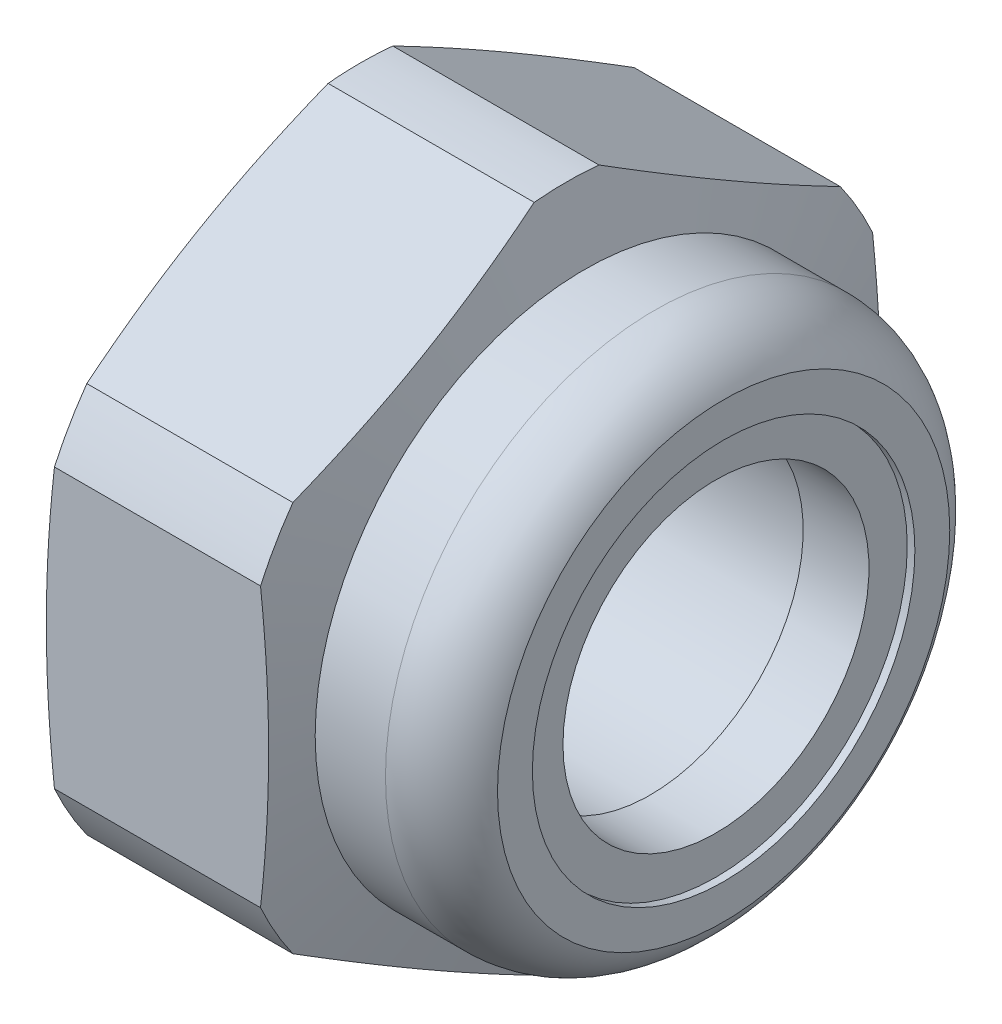
ISO-10303-21;
HEADER;
FILE_DESCRIPTION(('STEP AP214'),'2;1');
FILE_NAME('part.step','',(''),(''),'','','');
FILE_SCHEMA(('AUTOMOTIVE_DESIGN { 1 0 10303 214 1 1 1 1 }'));
ENDSEC;
DATA;
#1=APPLICATION_CONTEXT('core data for automotive mechanical design processes');
#2=APPLICATION_PROTOCOL_DEFINITION('international standard','automotive_design',2000,#1);
#3=PRODUCT_CONTEXT('',#1,'mechanical');
#4=PRODUCT('Part','Part','',(#3));
#5=PRODUCT_RELATED_PRODUCT_CATEGORY('part','',(#4));
#6=PRODUCT_DEFINITION_FORMATION('','',#4);
#7=PRODUCT_DEFINITION_CONTEXT('part definition',#1,'design');
#8=PRODUCT_DEFINITION('design','',#6,#7);
#9=PRODUCT_DEFINITION_SHAPE('','',#8);
#10=(LENGTH_UNIT() NAMED_UNIT(*) SI_UNIT(.MILLI.,.METRE.));
#11=(NAMED_UNIT(*) PLANE_ANGLE_UNIT() SI_UNIT($,.RADIAN.));
#12=(NAMED_UNIT(*) SI_UNIT($,.STERADIAN.) SOLID_ANGLE_UNIT());
#13=UNCERTAINTY_MEASURE_WITH_UNIT(LENGTH_MEASURE(1.E-05),#10,'distance_accuracy_value','');
#14=(GEOMETRIC_REPRESENTATION_CONTEXT(3) GLOBAL_UNCERTAINTY_ASSIGNED_CONTEXT((#13)) GLOBAL_UNIT_ASSIGNED_CONTEXT((#10,
#11,#12)) REPRESENTATION_CONTEXT('',''));
#15=CARTESIAN_POINT('',(0.,0.,0.));
#16=DIRECTION('',(0.,0.,1.));
#17=DIRECTION('',(1.,0.,0.));
#18=AXIS2_PLACEMENT_3D('',#15,#16,#17);
#19=CARTESIAN_POINT('',(1.47339400657629,0.,0.));
#20=DIRECTION('',(-1.,0.,0.));
#21=DIRECTION('',(0.,1.,0.));
#22=AXIS2_PLACEMENT_3D('',#19,#20,#21);
#23=CONICAL_SURFACE('',#22,3.9225,1.30899693899575);
#24=CARTESIAN_POINT('',(1.34678801315259,-4.37459941853982,0.422971544327751));
#25=CARTESIAN_POINT('',(1.54895552642481,-3.46410161513775,2.));
#26=CARTESIAN_POINT('',(1.34678801315259,-2.55360381173568,3.57702845567225));
#27=(BOUNDED_CURVE() B_SPLINE_CURVE(2,(#24,#25,#26),.UNSPECIFIED.,.F.,
.F.) B_SPLINE_CURVE_WITH_KNOTS((3,3),(0.,3.64813765694019),
.UNSPECIFIED.) CURVE() GEOMETRIC_REPRESENTATION_ITEM() RATIONAL_B_SPLINE_CURVE((1.,1.09875,1.)) REPRESENTATION_ITEM(''));
#28=CARTESIAN_POINT('',(1.34678801315259,-4.37459941853982,0.422971544327752));
#29=VERTEX_POINT('',#28);
#30=CARTESIAN_POINT('',(1.34678801315259,-2.55360381173568,3.57702845567225));
#31=VERTEX_POINT('',#30);
#32=EDGE_CURVE('E188',#29,#31,#27,.T.);
#33=ORIENTED_EDGE('',*,*,#32,.F.);
#34=CARTESIAN_POINT('',(1.34678801315259,0.,0.));
#35=DIRECTION('',(1.,0.,0.));
#36=DIRECTION('',(0.,1.,0.));
#37=AXIS2_PLACEMENT_3D('',#34,#35,#36);
#38=CIRCLE('',#37,4.395);
#39=CARTESIAN_POINT('',(1.34678801315259,-4.37459941853982,-0.42297154432775));
#40=VERTEX_POINT('',#39);
#41=EDGE_CURVE('E26',#29,#40,#38,.T.);
#42=ORIENTED_EDGE('',*,*,#41,.T.);
#43=CARTESIAN_POINT('',(1.34678801315259,-2.55360381173568,-3.57702845567225));
#44=CARTESIAN_POINT('',(1.54895552642481,-3.46410161513776,-2.));
#45=CARTESIAN_POINT('',(1.34678801315259,-4.37459941853983,-0.422971544327747));
#46=(BOUNDED_CURVE() B_SPLINE_CURVE(2,(#43,#44,#45),.UNSPECIFIED.,.F.,
.F.) B_SPLINE_CURVE_WITH_KNOTS((3,3),(0.,3.64813765694019),
.UNSPECIFIED.) CURVE() GEOMETRIC_REPRESENTATION_ITEM() RATIONAL_B_SPLINE_CURVE((1.,1.09875,1.)) REPRESENTATION_ITEM(''));
#47=CARTESIAN_POINT('',(1.34678801315259,-2.55360381173568,-3.57702845567225));
#48=VERTEX_POINT('',#47);
#49=EDGE_CURVE('E201',#48,#40,#46,.T.);
#50=ORIENTED_EDGE('',*,*,#49,.F.);
#51=CARTESIAN_POINT('',(1.34678801315259,0.,0.));
#52=DIRECTION('',(1.,0.,0.));
#53=DIRECTION('',(0.,1.,0.));
#54=AXIS2_PLACEMENT_3D('',#51,#52,#53);
#55=CIRCLE('',#54,4.395);
#56=CARTESIAN_POINT('',(1.34678801315259,-1.82099560680414,-4.));
#57=VERTEX_POINT('',#56);
#58=EDGE_CURVE('E103',#48,#57,#55,.T.);
#59=ORIENTED_EDGE('',*,*,#58,.T.);
#60=CARTESIAN_POINT('',(1.34678801315259,1.82099560680414,-4.));
#61=CARTESIAN_POINT('',(1.54895552642481,0.,-4.));
#62=CARTESIAN_POINT('',(1.34678801315259,-1.82099560680414,-4.));
#63=(BOUNDED_CURVE() B_SPLINE_CURVE(2,(#60,#61,#62),.UNSPECIFIED.,.F.,
.F.) B_SPLINE_CURVE_WITH_KNOTS((3,3),(0.,3.64813765694019),
.UNSPECIFIED.) CURVE() GEOMETRIC_REPRESENTATION_ITEM() RATIONAL_B_SPLINE_CURVE((1.,1.09875,1.)) REPRESENTATION_ITEM(''));
#64=CARTESIAN_POINT('',(1.34678801315259,1.82099560680414,-4.));
#65=VERTEX_POINT('',#64);
#66=EDGE_CURVE('E166',#65,#57,#63,.T.);
#67=ORIENTED_EDGE('',*,*,#66,.F.);
#68=CARTESIAN_POINT('',(1.34678801315259,0.,0.));
#69=DIRECTION('',(1.,0.,0.));
#70=DIRECTION('',(0.,1.,0.));
#71=AXIS2_PLACEMENT_3D('',#68,#69,#70);
#72=CIRCLE('',#71,4.395);
#73=CARTESIAN_POINT('',(1.34678801315259,2.55360381173568,-3.57702845567225));
#74=VERTEX_POINT('',#73);
#75=EDGE_CURVE('E111',#65,#74,#72,.T.);
#76=ORIENTED_EDGE('',*,*,#75,.T.);
#77=CARTESIAN_POINT('',(1.34678801315259,4.37459941853982,-0.422971544327753));
#78=CARTESIAN_POINT('',(1.54895552642481,3.46410161513775,-2.));
#79=CARTESIAN_POINT('',(1.34678801315259,2.55360381173568,-3.57702845567225));
#80=(BOUNDED_CURVE() B_SPLINE_CURVE(2,(#77,#78,#79),.UNSPECIFIED.,.F.,
.F.) B_SPLINE_CURVE_WITH_KNOTS((3,3),(0.,3.64813765694018),
.UNSPECIFIED.) CURVE() GEOMETRIC_REPRESENTATION_ITEM() RATIONAL_B_SPLINE_CURVE((1.,1.09875,1.)) REPRESENTATION_ITEM(''));
#81=CARTESIAN_POINT('',(1.34678801315259,4.37459941853982,-0.422971544327752));
#82=VERTEX_POINT('',#81);
#83=EDGE_CURVE('E162',#82,#74,#80,.T.);
#84=ORIENTED_EDGE('',*,*,#83,.F.);
#85=CARTESIAN_POINT('',(1.34678801315259,0.,0.));
#86=DIRECTION('',(1.,0.,0.));
#87=DIRECTION('',(0.,1.,0.));
#88=AXIS2_PLACEMENT_3D('',#85,#86,#87);
#89=CIRCLE('',#88,4.395);
#90=CARTESIAN_POINT('',(1.34678801315259,4.37459941853983,0.42297154432775));
#91=VERTEX_POINT('',#90);
#92=EDGE_CURVE('E200',#82,#91,#89,.T.);
#93=ORIENTED_EDGE('',*,*,#92,.T.);
#94=CARTESIAN_POINT('',(1.34678801315259,2.55360381173568,3.57702845567224));
#95=CARTESIAN_POINT('',(1.54895552642482,3.46410161513778,2.));
#96=CARTESIAN_POINT('',(1.34678801315259,4.37459941853982,0.422971544327751));
#97=(BOUNDED_CURVE() B_SPLINE_CURVE(2,(#94,#95,#96),.UNSPECIFIED.,.F.,
.F.) B_SPLINE_CURVE_WITH_KNOTS((3,3),(0.,3.64813765694018),
.UNSPECIFIED.) CURVE() GEOMETRIC_REPRESENTATION_ITEM() RATIONAL_B_SPLINE_CURVE((1.,1.09875,1.)) REPRESENTATION_ITEM(''));
#98=CARTESIAN_POINT('',(1.34678801315259,2.55360381173568,3.57702845567225));
#99=VERTEX_POINT('',#98);
#100=EDGE_CURVE('E157',#99,#91,#97,.T.);
#101=ORIENTED_EDGE('',*,*,#100,.F.);
#102=CARTESIAN_POINT('',(1.34678801315259,0.,0.));
#103=DIRECTION('',(1.,0.,0.));
#104=DIRECTION('',(0.,1.,0.));
#105=AXIS2_PLACEMENT_3D('',#102,#103,#104);
#106=CIRCLE('',#105,4.395);
#107=CARTESIAN_POINT('',(1.34678801315259,1.82099560680415,4.));
#108=VERTEX_POINT('',#107);
#109=EDGE_CURVE('E224',#99,#108,#106,.T.);
#110=ORIENTED_EDGE('',*,*,#109,.T.);
#111=CARTESIAN_POINT('',(1.34678801315259,-1.82099560680414,4.));
#112=CARTESIAN_POINT('',(1.54895552642481,0.,4.));
#113=CARTESIAN_POINT('',(1.34678801315259,1.82099560680415,4.));
#114=(BOUNDED_CURVE() B_SPLINE_CURVE(2,(#111,#112,#113),.UNSPECIFIED.,.F.,
.F.) B_SPLINE_CURVE_WITH_KNOTS((3,3),(0.,3.64813765694019),
.UNSPECIFIED.) CURVE() GEOMETRIC_REPRESENTATION_ITEM() RATIONAL_B_SPLINE_CURVE((1.,1.09875,1.)) REPRESENTATION_ITEM(''));
#115=CARTESIAN_POINT('',(1.34678801315259,-1.82099560680414,4.));
#116=VERTEX_POINT('',#115);
#117=EDGE_CURVE('E242',#116,#108,#114,.T.);
#118=ORIENTED_EDGE('',*,*,#117,.F.);
#119=CARTESIAN_POINT('',(1.34678801315259,0.,0.));
#120=DIRECTION('',(1.,0.,0.));
#121=DIRECTION('',(0.,1.,0.));
#122=AXIS2_PLACEMENT_3D('',#119,#120,#121);
#123=CIRCLE('',#122,4.395);
#124=EDGE_CURVE('E179',#116,#31,#123,.T.);
#125=ORIENTED_EDGE('',*,*,#124,.T.);
#126=EDGE_LOOP('',(#33,#42,#50,#59,#67,#76,#84,#93,#101,#110,#118,#125));
#127=FACE_BOUND('',#126,.T.);
#128=CARTESIAN_POINT('',(1.58124355652982,0.,0.));
#129=DIRECTION('',(-1.,0.,0.));
#130=DIRECTION('',(0.,0.,-1.));
#131=AXIS2_PLACEMENT_3D('',#128,#129,#130);
#132=CIRCLE('',#131,3.52);
#133=CARTESIAN_POINT('',(1.58124355652982,0.,3.52));
#134=VERTEX_POINT('',#133);
#135=EDGE_CURVE('E145',#134,#134,#132,.T.);
#136=ORIENTED_EDGE('',*,*,#135,.T.);
#137=EDGE_LOOP('',(#136));
#138=FACE_BOUND('',#137,.T.);
#139=ADVANCED_FACE('F16',(#127,#138),#23,.T.);
#140=CARTESIAN_POINT('',(-1.6,1.725,0.));
#141=DIRECTION('',(-1.,0.,0.));
#142=DIRECTION('',(0.,-1.,0.));
#143=AXIS2_PLACEMENT_3D('',#140,#141,#142);
#144=PLANE('',#143);
#145=CARTESIAN_POINT('',(-1.6,0.,0.));
#146=DIRECTION('',(1.,0.,0.));
#147=DIRECTION('',(0.,1.,0.));
#148=AXIS2_PLACEMENT_3D('',#145,#146,#147);
#149=CIRCLE('',#148,3.45);
#150=CARTESIAN_POINT('',(-1.6,3.45,0.));
#151=VERTEX_POINT('',#150);
#152=EDGE_CURVE('E10',#151,#151,#149,.T.);
#153=ORIENTED_EDGE('',*,*,#152,.F.);
#154=EDGE_LOOP('',(#153));
#155=FACE_BOUND('',#154,.T.);
#156=CARTESIAN_POINT('',(-1.6,0.,0.));
#157=DIRECTION('',(1.,0.,0.));
#158=DIRECTION('',(0.,1.,0.));
#159=AXIS2_PLACEMENT_3D('',#156,#157,#158);
#160=CIRCLE('',#159,2.5);
#161=CARTESIAN_POINT('',(-1.6,2.5,0.));
#162=VERTEX_POINT('',#161);
#163=EDGE_CURVE('E139',#162,#162,#160,.T.);
#164=ORIENTED_EDGE('',*,*,#163,.T.);
#165=EDGE_LOOP('',(#164));
#166=FACE_BOUND('',#165,.T.);
#167=ADVANCED_FACE('F140',(#155,#166),#144,.T.);
#168=CARTESIAN_POINT('',(-1.47339400657629,0.,0.));
#169=DIRECTION('',(1.,0.,0.));
#170=DIRECTION('',(0.,1.,0.));
#171=AXIS2_PLACEMENT_3D('',#168,#169,#170);
#172=CONICAL_SURFACE('',#171,3.9225,1.30899693899575);
#173=CARTESIAN_POINT('',(-1.34678801315259,-2.55360381173568,3.57702845567225));
#174=CARTESIAN_POINT('',(-1.54895552642481,-3.46410161513775,2.));
#175=CARTESIAN_POINT('',(-1.34678801315259,-4.37459941853982,0.422971544327751));
#176=(BOUNDED_CURVE() B_SPLINE_CURVE(2,(#173,#174,#175),.UNSPECIFIED.,.F.,
.F.) B_SPLINE_CURVE_WITH_KNOTS((3,3),(0.,3.64813765694019),
.UNSPECIFIED.) CURVE() GEOMETRIC_REPRESENTATION_ITEM() RATIONAL_B_SPLINE_CURVE((1.,1.09875,1.)) REPRESENTATION_ITEM(''));
#177=CARTESIAN_POINT('',(-1.34678801315259,-2.55360381173568,3.57702845567225));
#178=VERTEX_POINT('',#177);
#179=CARTESIAN_POINT('',(-1.34678801315259,-4.37459941853982,0.422971544327752));
#180=VERTEX_POINT('',#179);
#181=EDGE_CURVE('E260',#178,#180,#176,.T.);
#182=ORIENTED_EDGE('',*,*,#181,.F.);
#183=CARTESIAN_POINT('',(-1.34678801315259,0.,0.));
#184=DIRECTION('',(1.,0.,0.));
#185=DIRECTION('',(0.,1.,0.));
#186=AXIS2_PLACEMENT_3D('',#183,#184,#185);
#187=CIRCLE('',#186,4.395);
#188=CARTESIAN_POINT('',(-1.34678801315259,-1.82099560680414,4.));
#189=VERTEX_POINT('',#188);
#190=EDGE_CURVE('E250',#189,#178,#187,.T.);
#191=ORIENTED_EDGE('',*,*,#190,.F.);
#192=CARTESIAN_POINT('',(-1.34678801315259,1.82099560680414,4.));
#193=CARTESIAN_POINT('',(-1.54895552642481,0.,4.));
#194=CARTESIAN_POINT('',(-1.34678801315259,-1.82099560680414,4.));
#195=(BOUNDED_CURVE() B_SPLINE_CURVE(2,(#192,#193,#194),.UNSPECIFIED.,.F.,
.F.) B_SPLINE_CURVE_WITH_KNOTS((3,3),(0.,3.64813765694018),
.UNSPECIFIED.) CURVE() GEOMETRIC_REPRESENTATION_ITEM() RATIONAL_B_SPLINE_CURVE((1.,1.09875,1.)) REPRESENTATION_ITEM(''));
#196=CARTESIAN_POINT('',(-1.34678801315259,1.82099560680415,4.));
#197=VERTEX_POINT('',#196);
#198=EDGE_CURVE('E284',#197,#189,#195,.T.);
#199=ORIENTED_EDGE('',*,*,#198,.F.);
#200=CARTESIAN_POINT('',(-1.34678801315259,0.,0.));
#201=DIRECTION('',(1.,0.,0.));
#202=DIRECTION('',(0.,1.,0.));
#203=AXIS2_PLACEMENT_3D('',#200,#201,#202);
#204=CIRCLE('',#203,4.395);
#205=CARTESIAN_POINT('',(-1.34678801315259,2.55360381173568,3.57702845567225));
#206=VERTEX_POINT('',#205);
#207=EDGE_CURVE('E226',#206,#197,#204,.T.);
#208=ORIENTED_EDGE('',*,*,#207,.F.);
#209=CARTESIAN_POINT('',(-1.34678801315259,4.37459941853982,0.42297154432775));
#210=CARTESIAN_POINT('',(-1.54895552642481,3.46410161513775,2.));
#211=CARTESIAN_POINT('',(-1.34678801315259,2.55360381173568,3.57702845567224));
#212=(BOUNDED_CURVE() B_SPLINE_CURVE(2,(#209,#210,#211),.UNSPECIFIED.,.F.,
.F.) B_SPLINE_CURVE_WITH_KNOTS((3,3),(0.,3.64813765694018),
.UNSPECIFIED.) CURVE() GEOMETRIC_REPRESENTATION_ITEM() RATIONAL_B_SPLINE_CURVE((1.,1.09875,1.)) REPRESENTATION_ITEM(''));
#213=CARTESIAN_POINT('',(-1.34678801315259,4.37459941853983,0.42297154432775));
#214=VERTEX_POINT('',#213);
#215=EDGE_CURVE('E167',#214,#206,#212,.T.);
#216=ORIENTED_EDGE('',*,*,#215,.F.);
#217=CARTESIAN_POINT('',(-1.34678801315259,0.,0.));
#218=DIRECTION('',(1.,0.,0.));
#219=DIRECTION('',(0.,1.,0.));
#220=AXIS2_PLACEMENT_3D('',#217,#218,#219);
#221=CIRCLE('',#220,4.395);
#222=CARTESIAN_POINT('',(-1.34678801315259,4.37459941853982,-0.422971544327752));
#223=VERTEX_POINT('',#222);
#224=EDGE_CURVE('E203',#223,#214,#221,.T.);
#225=ORIENTED_EDGE('',*,*,#224,.F.);
#226=CARTESIAN_POINT('',(-1.34678801315259,2.55360381173568,-3.57702845567225));
#227=CARTESIAN_POINT('',(-1.54895552642481,3.46410161513777,-2.));
#228=CARTESIAN_POINT('',(-1.34678801315259,4.37459941853982,-0.422971544327752));
#229=(BOUNDED_CURVE() B_SPLINE_CURVE(2,(#226,#227,#228),.UNSPECIFIED.,.F.,
.F.) B_SPLINE_CURVE_WITH_KNOTS((3,3),(0.,3.64813765694019),
.UNSPECIFIED.) CURVE() GEOMETRIC_REPRESENTATION_ITEM() RATIONAL_B_SPLINE_CURVE((1.,1.09875,1.)) REPRESENTATION_ITEM(''));
#230=CARTESIAN_POINT('',(-1.34678801315259,2.55360381173568,-3.57702845567225));
#231=VERTEX_POINT('',#230);
#232=EDGE_CURVE('E156',#231,#223,#229,.T.);
#233=ORIENTED_EDGE('',*,*,#232,.F.);
#234=CARTESIAN_POINT('',(-1.34678801315259,0.,0.));
#235=DIRECTION('',(1.,0.,0.));
#236=DIRECTION('',(0.,1.,0.));
#237=AXIS2_PLACEMENT_3D('',#234,#235,#236);
#238=CIRCLE('',#237,4.395);
#239=CARTESIAN_POINT('',(-1.34678801315259,1.82099560680414,-4.));
#240=VERTEX_POINT('',#239);
#241=EDGE_CURVE('E151',#240,#231,#238,.T.);
#242=ORIENTED_EDGE('',*,*,#241,.F.);
#243=CARTESIAN_POINT('',(-1.34678801315259,-1.82099560680414,-4.));
#244=CARTESIAN_POINT('',(-1.54895552642481,0.,-4.));
#245=CARTESIAN_POINT('',(-1.34678801315259,1.82099560680414,-4.));
#246=(BOUNDED_CURVE() B_SPLINE_CURVE(2,(#243,#244,#245),.UNSPECIFIED.,.F.,
.F.) B_SPLINE_CURVE_WITH_KNOTS((3,3),(0.,3.64813765694018),
.UNSPECIFIED.) CURVE() GEOMETRIC_REPRESENTATION_ITEM() RATIONAL_B_SPLINE_CURVE((1.,1.09875,1.)) REPRESENTATION_ITEM(''));
#247=CARTESIAN_POINT('',(-1.34678801315259,-1.82099560680414,-4.));
#248=VERTEX_POINT('',#247);
#249=EDGE_CURVE('E161',#248,#240,#246,.T.);
#250=ORIENTED_EDGE('',*,*,#249,.F.);
#251=CARTESIAN_POINT('',(-1.34678801315259,0.,0.));
#252=DIRECTION('',(1.,0.,0.));
#253=DIRECTION('',(0.,1.,0.));
#254=AXIS2_PLACEMENT_3D('',#251,#252,#253);
#255=CIRCLE('',#254,4.395);
#256=CARTESIAN_POINT('',(-1.34678801315259,-2.55360381173568,-3.57702845567225));
#257=VERTEX_POINT('',#256);
#258=EDGE_CURVE('E174',#257,#248,#255,.T.);
#259=ORIENTED_EDGE('',*,*,#258,.F.);
#260=CARTESIAN_POINT('',(-1.34678801315259,-4.37459941853982,-0.422971544327751));
#261=CARTESIAN_POINT('',(-1.54895552642481,-3.46410161513776,-2.));
#262=CARTESIAN_POINT('',(-1.34678801315259,-2.55360381173568,-3.57702845567225));
#263=(BOUNDED_CURVE() B_SPLINE_CURVE(2,(#260,#261,#262),.UNSPECIFIED.,.F.,
.F.) B_SPLINE_CURVE_WITH_KNOTS((3,3),(0.,3.64813765694018),
.UNSPECIFIED.) CURVE() GEOMETRIC_REPRESENTATION_ITEM() RATIONAL_B_SPLINE_CURVE((1.,1.09875,1.)) REPRESENTATION_ITEM(''));
#264=CARTESIAN_POINT('',(-1.34678801315259,-4.37459941853982,-0.42297154432775));
#265=VERTEX_POINT('',#264);
#266=EDGE_CURVE('E213',#265,#257,#263,.T.);
#267=ORIENTED_EDGE('',*,*,#266,.F.);
#268=CARTESIAN_POINT('',(-1.34678801315259,0.,0.));
#269=DIRECTION('',(1.,0.,0.));
#270=DIRECTION('',(0.,1.,0.));
#271=AXIS2_PLACEMENT_3D('',#268,#269,#270);
#272=CIRCLE('',#271,4.395);
#273=EDGE_CURVE('E254',#180,#265,#272,.T.);
#274=ORIENTED_EDGE('',*,*,#273,.F.);
#275=EDGE_LOOP('',(#182,#191,#199,#208,#216,#225,#233,#242,#250,#259,#267,#274));
#276=FACE_BOUND('',#275,.T.);
#277=ORIENTED_EDGE('',*,*,#152,.T.);
#278=EDGE_LOOP('',(#277));
#279=FACE_BOUND('',#278,.T.);
#280=ADVANCED_FACE('F320',(#276,#279),#172,.T.);
#281=CARTESIAN_POINT('',(0.,0.,0.));
#282=DIRECTION('',(-1.,0.,0.));
#283=DIRECTION('',(0.,1.,0.));
#284=AXIS2_PLACEMENT_3D('',#281,#282,#283);
#285=CYLINDRICAL_SURFACE('',#284,4.395);
#286=DIRECTION('',(1.,0.,0.));
#287=VECTOR('',#286,1.);
#288=CARTESIAN_POINT('',(0.,-4.37459941853982,0.422971544327752));
#289=LINE('',#288,#287);
#290=EDGE_CURVE('E193',#180,#29,#289,.T.);
#291=ORIENTED_EDGE('',*,*,#290,.F.);
#292=ORIENTED_EDGE('',*,*,#273,.T.);
#293=DIRECTION('',(-1.,0.,0.));
#294=VECTOR('',#293,1.);
#295=CARTESIAN_POINT('',(0.,-4.37459941853982,-0.42297154432775));
#296=LINE('',#295,#294);
#297=EDGE_CURVE('E194',#40,#265,#296,.T.);
#298=ORIENTED_EDGE('',*,*,#297,.F.);
#299=ORIENTED_EDGE('',*,*,#41,.F.);
#300=EDGE_LOOP('',(#291,#292,#298,#299));
#301=FACE_BOUND('',#300,.T.);
#302=ADVANCED_FACE('F402',(#301),#285,.T.);
#303=CARTESIAN_POINT('',(0.,0.,0.));
#304=DIRECTION('',(-1.,0.,0.));
#305=DIRECTION('',(0.,1.,0.));
#306=AXIS2_PLACEMENT_3D('',#303,#304,#305);
#307=CYLINDRICAL_SURFACE('',#306,4.395);
#308=DIRECTION('',(-1.,0.,0.));
#309=VECTOR('',#308,1.);
#310=CARTESIAN_POINT('',(0.,-2.55360381173568,3.57702845567225));
#311=LINE('',#310,#309);
#312=EDGE_CURVE('E20',#31,#178,#311,.T.);
#313=ORIENTED_EDGE('',*,*,#312,.F.);
#314=ORIENTED_EDGE('',*,*,#124,.F.);
#315=DIRECTION('',(1.,0.,0.));
#316=VECTOR('',#315,1.);
#317=CARTESIAN_POINT('',(0.,-1.82099560680414,4.));
#318=LINE('',#317,#316);
#319=EDGE_CURVE('E289',#189,#116,#318,.T.);
#320=ORIENTED_EDGE('',*,*,#319,.F.);
#321=ORIENTED_EDGE('',*,*,#190,.T.);
#322=EDGE_LOOP('',(#313,#314,#320,#321));
#323=FACE_BOUND('',#322,.T.);
#324=ADVANCED_FACE('F406',(#323),#307,.T.);
#325=CARTESIAN_POINT('',(0.,0.,0.));
#326=DIRECTION('',(-1.,0.,0.));
#327=DIRECTION('',(0.,1.,0.));
#328=AXIS2_PLACEMENT_3D('',#325,#326,#327);
#329=CYLINDRICAL_SURFACE('',#328,4.395);
#330=DIRECTION('',(-1.,0.,0.));
#331=VECTOR('',#330,1.);
#332=CARTESIAN_POINT('',(0.,-1.82099560680414,-4.));
#333=LINE('',#332,#331);
#334=EDGE_CURVE('E183',#57,#248,#333,.T.);
#335=ORIENTED_EDGE('',*,*,#334,.F.);
#336=ORIENTED_EDGE('',*,*,#58,.F.);
#337=DIRECTION('',(1.,0.,0.));
#338=VECTOR('',#337,1.);
#339=CARTESIAN_POINT('',(0.,-2.55360381173568,-3.57702845567225));
#340=LINE('',#339,#338);
#341=EDGE_CURVE('E218',#257,#48,#340,.T.);
#342=ORIENTED_EDGE('',*,*,#341,.F.);
#343=ORIENTED_EDGE('',*,*,#258,.T.);
#344=EDGE_LOOP('',(#335,#336,#342,#343));
#345=FACE_BOUND('',#344,.T.);
#346=ADVANCED_FACE('F337',(#345),#329,.T.);
#347=CARTESIAN_POINT('',(0.,0.,0.));
#348=DIRECTION('',(-1.,0.,0.));
#349=DIRECTION('',(0.,1.,0.));
#350=AXIS2_PLACEMENT_3D('',#347,#348,#349);
#351=CYLINDRICAL_SURFACE('',#350,4.395);
#352=DIRECTION('',(-1.,0.,0.));
#353=VECTOR('',#352,1.);
#354=CARTESIAN_POINT('',(0.,1.82099560680415,4.));
#355=LINE('',#354,#353);
#356=EDGE_CURVE('E173',#108,#197,#355,.T.);
#357=ORIENTED_EDGE('',*,*,#356,.F.);
#358=ORIENTED_EDGE('',*,*,#109,.F.);
#359=DIRECTION('',(1.,0.,0.));
#360=VECTOR('',#359,1.);
#361=CARTESIAN_POINT('',(0.,2.55360381173568,3.57702845567225));
#362=LINE('',#361,#360);
#363=EDGE_CURVE('E172',#206,#99,#362,.T.);
#364=ORIENTED_EDGE('',*,*,#363,.F.);
#365=ORIENTED_EDGE('',*,*,#207,.T.);
#366=EDGE_LOOP('',(#357,#358,#364,#365));
#367=FACE_BOUND('',#366,.T.);
#368=ADVANCED_FACE('F328',(#367),#351,.T.);
#369=CARTESIAN_POINT('',(0.,0.,0.));
#370=DIRECTION('',(-1.,0.,0.));
#371=DIRECTION('',(0.,1.,0.));
#372=AXIS2_PLACEMENT_3D('',#369,#370,#371);
#373=CYLINDRICAL_SURFACE('',#372,4.395);
#374=DIRECTION('',(-1.,0.,0.));
#375=VECTOR('',#374,1.);
#376=CARTESIAN_POINT('',(0.,2.55360381173568,-3.57702845567225));
#377=LINE('',#376,#375);
#378=EDGE_CURVE('E158',#74,#231,#377,.T.);
#379=ORIENTED_EDGE('',*,*,#378,.F.);
#380=ORIENTED_EDGE('',*,*,#75,.F.);
#381=DIRECTION('',(1.,0.,0.));
#382=VECTOR('',#381,1.);
#383=CARTESIAN_POINT('',(0.,1.82099560680414,-4.));
#384=LINE('',#383,#382);
#385=EDGE_CURVE('E163',#240,#65,#384,.T.);
#386=ORIENTED_EDGE('',*,*,#385,.F.);
#387=ORIENTED_EDGE('',*,*,#241,.T.);
#388=EDGE_LOOP('',(#379,#380,#386,#387));
#389=FACE_BOUND('',#388,.T.);
#390=ADVANCED_FACE('F325',(#389),#373,.T.);
#391=CARTESIAN_POINT('',(0.,0.,0.));
#392=DIRECTION('',(-1.,0.,0.));
#393=DIRECTION('',(0.,1.,0.));
#394=AXIS2_PLACEMENT_3D('',#391,#392,#393);
#395=CYLINDRICAL_SURFACE('',#394,4.395);
#396=DIRECTION('',(-1.,0.,0.));
#397=VECTOR('',#396,1.);
#398=CARTESIAN_POINT('',(0.,4.37459941853983,0.42297154432775));
#399=LINE('',#398,#397);
#400=EDGE_CURVE('E153',#91,#214,#399,.T.);
#401=ORIENTED_EDGE('',*,*,#400,.F.);
#402=ORIENTED_EDGE('',*,*,#92,.F.);
#403=DIRECTION('',(1.,0.,0.));
#404=VECTOR('',#403,1.);
#405=CARTESIAN_POINT('',(0.,4.37459941853982,-0.422971544327752));
#406=LINE('',#405,#404);
#407=EDGE_CURVE('E245',#223,#82,#406,.T.);
#408=ORIENTED_EDGE('',*,*,#407,.F.);
#409=ORIENTED_EDGE('',*,*,#224,.T.);
#410=EDGE_LOOP('',(#401,#402,#408,#409));
#411=FACE_BOUND('',#410,.T.);
#412=ADVANCED_FACE('F327',(#411),#395,.T.);
#413=CARTESIAN_POINT('',(-2.1,-3.46410161513775,-2.));
#414=DIRECTION('',(0.,-0.866025403784439,-0.5));
#415=DIRECTION('',(0.,0.5,-0.866025403784439));
#416=AXIS2_PLACEMENT_3D('',#413,#414,#415);
#417=PLANE('',#416);
#418=ORIENTED_EDGE('',*,*,#266,.T.);
#419=ORIENTED_EDGE('',*,*,#341,.T.);
#420=ORIENTED_EDGE('',*,*,#49,.T.);
#421=ORIENTED_EDGE('',*,*,#297,.T.);
#422=EDGE_LOOP('',(#418,#419,#420,#421));
#423=FACE_BOUND('',#422,.T.);
#424=ADVANCED_FACE('F335',(#423),#417,.T.);
#425=CARTESIAN_POINT('',(-2.1,0.,-4.));
#426=DIRECTION('',(0.,0.,-1.));
#427=DIRECTION('',(0.,1.,0.));
#428=AXIS2_PLACEMENT_3D('',#425,#426,#427);
#429=PLANE('',#428);
#430=ORIENTED_EDGE('',*,*,#249,.T.);
#431=ORIENTED_EDGE('',*,*,#385,.T.);
#432=ORIENTED_EDGE('',*,*,#66,.T.);
#433=ORIENTED_EDGE('',*,*,#334,.T.);
#434=EDGE_LOOP('',(#430,#431,#432,#433));
#435=FACE_BOUND('',#434,.T.);
#436=ADVANCED_FACE('F317',(#435),#429,.T.);
#437=CARTESIAN_POINT('',(-2.1,3.46410161513775,-2.));
#438=DIRECTION('',(0.,0.866025403784439,-0.5));
#439=DIRECTION('',(0.,0.5,0.866025403784439));
#440=AXIS2_PLACEMENT_3D('',#437,#438,#439);
#441=PLANE('',#440);
#442=ORIENTED_EDGE('',*,*,#232,.T.);
#443=ORIENTED_EDGE('',*,*,#407,.T.);
#444=ORIENTED_EDGE('',*,*,#83,.T.);
#445=ORIENTED_EDGE('',*,*,#378,.T.);
#446=EDGE_LOOP('',(#442,#443,#444,#445));
#447=FACE_BOUND('',#446,.T.);
#448=ADVANCED_FACE('F419',(#447),#441,.T.);
#449=CARTESIAN_POINT('',(-2.1,3.46410161513775,2.));
#450=DIRECTION('',(0.,0.866025403784439,0.5));
#451=DIRECTION('',(0.,-0.5,0.866025403784439));
#452=AXIS2_PLACEMENT_3D('',#449,#450,#451);
#453=PLANE('',#452);
#454=ORIENTED_EDGE('',*,*,#215,.T.);
#455=ORIENTED_EDGE('',*,*,#363,.T.);
#456=ORIENTED_EDGE('',*,*,#100,.T.);
#457=ORIENTED_EDGE('',*,*,#400,.T.);
#458=EDGE_LOOP('',(#454,#455,#456,#457));
#459=FACE_BOUND('',#458,.T.);
#460=ADVANCED_FACE('F423',(#459),#453,.T.);
#461=CARTESIAN_POINT('',(-2.1,0.,4.));
#462=DIRECTION('',(0.,0.,1.));
#463=DIRECTION('',(0.,-1.,0.));
#464=AXIS2_PLACEMENT_3D('',#461,#462,#463);
#465=PLANE('',#464);
#466=ORIENTED_EDGE('',*,*,#198,.T.);
#467=ORIENTED_EDGE('',*,*,#319,.T.);
#468=ORIENTED_EDGE('',*,*,#117,.T.);
#469=ORIENTED_EDGE('',*,*,#356,.T.);
#470=EDGE_LOOP('',(#466,#467,#468,#469));
#471=FACE_BOUND('',#470,.T.);
#472=ADVANCED_FACE('F421',(#471),#465,.T.);
#473=CARTESIAN_POINT('',(-2.1,-3.46410161513775,2.));
#474=DIRECTION('',(0.,-0.866025403784439,0.5));
#475=DIRECTION('',(0.,-0.5,-0.866025403784439));
#476=AXIS2_PLACEMENT_3D('',#473,#474,#475);
#477=PLANE('',#476);
#478=ORIENTED_EDGE('',*,*,#181,.T.);
#479=ORIENTED_EDGE('',*,*,#290,.T.);
#480=ORIENTED_EDGE('',*,*,#32,.T.);
#481=ORIENTED_EDGE('',*,*,#312,.T.);
#482=EDGE_LOOP('',(#478,#479,#480,#481));
#483=FACE_BOUND('',#482,.T.);
#484=ADVANCED_FACE('F397',(#483),#477,.T.);
#485=CARTESIAN_POINT('',(3.4,0.,0.));
#486=DIRECTION('',(1.,0.,0.));
#487=DIRECTION('',(0.,0.,-1.));
#488=AXIS2_PLACEMENT_3D('',#485,#486,#487);
#489=PLANE('',#488);
#490=CARTESIAN_POINT('',(3.4,0.,0.));
#491=DIRECTION('',(1.,0.,0.));
#492=DIRECTION('',(0.,0.,-1.));
#493=AXIS2_PLACEMENT_3D('',#490,#491,#492);
#494=CIRCLE('',#493,2.95588989435407);
#495=CARTESIAN_POINT('',(3.4,0.,2.95588989435407));
#496=VERTEX_POINT('',#495);
#497=EDGE_CURVE('E267',#496,#496,#494,.T.);
#498=ORIENTED_EDGE('',*,*,#497,.T.);
#499=EDGE_LOOP('',(#498));
#500=FACE_BOUND('',#499,.T.);
#501=CARTESIAN_POINT('',(3.4,0.,0.));
#502=DIRECTION('',(-1.,0.,0.));
#503=DIRECTION('',(0.,1.,0.));
#504=AXIS2_PLACEMENT_3D('',#501,#502,#503);
#505=CIRCLE('',#504,2.5);
#506=CARTESIAN_POINT('',(3.4,2.5,0.));
#507=VERTEX_POINT('',#506);
#508=EDGE_CURVE('E147',#507,#507,#505,.T.);
#509=ORIENTED_EDGE('',*,*,#508,.T.);
#510=EDGE_LOOP('',(#509));
#511=FACE_BOUND('',#510,.T.);
#512=ADVANCED_FACE('F394',(#500,#511),#489,.T.);
#513=CARTESIAN_POINT('',(2.5,0.,0.));
#514=DIRECTION('',(1.,0.,0.));
#515=DIRECTION('',(0.,0.,1.));
#516=AXIS2_PLACEMENT_3D('',#513,#514,#515);
#517=TOROIDAL_SURFACE('',#516,2.52,1.);
#518=ORIENTED_EDGE('',*,*,#497,.F.);
#519=EDGE_LOOP('',(#518));
#520=FACE_BOUND('',#519,.T.);
#521=CARTESIAN_POINT('',(2.5,0.,0.));
#522=DIRECTION('',(-1.,0.,0.));
#523=DIRECTION('',(0.,0.,-1.));
#524=AXIS2_PLACEMENT_3D('',#521,#522,#523);
#525=CIRCLE('',#524,3.52);
#526=CARTESIAN_POINT('',(2.5,-3.52,0.));
#527=VERTEX_POINT('',#526);
#528=EDGE_CURVE('E142',#527,#527,#525,.T.);
#529=ORIENTED_EDGE('',*,*,#528,.F.);
#530=EDGE_LOOP('',(#529));
#531=FACE_BOUND('',#530,.T.);
#532=ADVANCED_FACE('F396',(#520,#531),#517,.T.);
#533=CARTESIAN_POINT('',(1.7,0.,0.));
#534=DIRECTION('',(-1.,0.,0.));
#535=DIRECTION('',(0.,0.,-1.));
#536=AXIS2_PLACEMENT_3D('',#533,#534,#535);
#537=CYLINDRICAL_SURFACE('',#536,3.52);
#538=ORIENTED_EDGE('',*,*,#135,.F.);
#539=EDGE_LOOP('',(#538));
#540=FACE_BOUND('',#539,.T.);
#541=ORIENTED_EDGE('',*,*,#528,.T.);
#542=EDGE_LOOP('',(#541));
#543=FACE_BOUND('',#542,.T.);
#544=ADVANCED_FACE('F18',(#540,#543),#537,.T.);
#545=CARTESIAN_POINT('',(0.9,0.,0.));
#546=DIRECTION('',(-1.,0.,0.));
#547=DIRECTION('',(0.,1.,0.));
#548=AXIS2_PLACEMENT_3D('',#545,#546,#547);
#549=CYLINDRICAL_SURFACE('',#548,2.067);
#550=CARTESIAN_POINT('',(-1.167,0.,0.));
#551=DIRECTION('',(1.,0.,0.));
#552=DIRECTION('',(0.,1.,0.));
#553=AXIS2_PLACEMENT_3D('',#550,#551,#552);
#554=CIRCLE('',#553,2.067);
#555=CARTESIAN_POINT('',(-1.167,2.067,0.));
#556=VERTEX_POINT('',#555);
#557=EDGE_CURVE('E143',#556,#556,#554,.T.);
#558=ORIENTED_EDGE('',*,*,#557,.F.);
#559=EDGE_LOOP('',(#558));
#560=FACE_BOUND('',#559,.T.);
#561=CARTESIAN_POINT('',(2.44,0.,0.));
#562=DIRECTION('',(1.,0.,0.));
#563=DIRECTION('',(0.,1.,0.));
#564=AXIS2_PLACEMENT_3D('',#561,#562,#563);
#565=CIRCLE('',#564,2.067);
#566=CARTESIAN_POINT('',(2.44,-2.067,0.));
#567=VERTEX_POINT('',#566);
#568=EDGE_CURVE('E212',#567,#567,#565,.T.);
#569=ORIENTED_EDGE('',*,*,#568,.T.);
#570=EDGE_LOOP('',(#569));
#571=FACE_BOUND('',#570,.T.);
#572=ADVANCED_FACE('F353',(#560,#571),#549,.F.);
#573=CARTESIAN_POINT('',(-1.3835,0.,0.));
#574=DIRECTION('',(-1.,0.,0.));
#575=DIRECTION('',(0.,1.,0.));
#576=AXIS2_PLACEMENT_3D('',#573,#574,#575);
#577=CONICAL_SURFACE('',#576,2.2835,0.785398163397449);
#578=ORIENTED_EDGE('',*,*,#163,.F.);
#579=EDGE_LOOP('',(#578));
#580=FACE_BOUND('',#579,.T.);
#581=ORIENTED_EDGE('',*,*,#557,.T.);
#582=EDGE_LOOP('',(#581));
#583=FACE_BOUND('',#582,.T.);
#584=ADVANCED_FACE('F356',(#580,#583),#577,.F.);
#585=CARTESIAN_POINT('',(3.58,0.,0.));
#586=DIRECTION('',(1.,0.,0.));
#587=DIRECTION('',(0.,0.,1.));
#588=AXIS2_PLACEMENT_3D('',#585,#586,#587);
#589=CYLINDRICAL_SURFACE('',#588,2.5);
#590=ORIENTED_EDGE('',*,*,#508,.F.);
#591=EDGE_LOOP('',(#590));
#592=FACE_BOUND('',#591,.T.);
#593=CARTESIAN_POINT('',(3.3,0.,0.));
#594=DIRECTION('',(-1.,0.,0.));
#595=DIRECTION('',(0.,0.,1.));
#596=AXIS2_PLACEMENT_3D('',#593,#594,#595);
#597=CIRCLE('',#596,2.5);
#598=CARTESIAN_POINT('',(3.3,0.,-2.5));
#599=VERTEX_POINT('',#598);
#600=EDGE_CURVE('E229',#599,#599,#597,.T.);
#601=ORIENTED_EDGE('',*,*,#600,.T.);
#602=EDGE_LOOP('',(#601));
#603=FACE_BOUND('',#602,.T.);
#604=ADVANCED_FACE('F358',(#592,#603),#589,.F.);
#605=CARTESIAN_POINT('',(2.2,0.,0.));
#606=DIRECTION('',(-1.,0.,0.));
#607=DIRECTION('',(0.,0.,-1.));
#608=AXIS2_PLACEMENT_3D('',#605,#606,#607);
#609=CYLINDRICAL_SURFACE('',#608,2.);
#610=CARTESIAN_POINT('',(3.3,0.,0.));
#611=DIRECTION('',(-1.,0.,0.));
#612=DIRECTION('',(0.,0.,-1.));
#613=AXIS2_PLACEMENT_3D('',#610,#611,#612);
#614=CIRCLE('',#613,2.);
#615=CARTESIAN_POINT('',(3.3,0.,2.));
#616=VERTEX_POINT('',#615);
#617=EDGE_CURVE('E227',#616,#616,#614,.T.);
#618=ORIENTED_EDGE('',*,*,#617,.F.);
#619=EDGE_LOOP('',(#618));
#620=FACE_BOUND('',#619,.T.);
#621=CARTESIAN_POINT('',(2.44,0.,0.));
#622=DIRECTION('',(1.,0.,0.));
#623=DIRECTION('',(0.,0.,-1.));
#624=AXIS2_PLACEMENT_3D('',#621,#622,#623);
#625=CIRCLE('',#624,2.);
#626=CARTESIAN_POINT('',(2.44,0.,2.));
#627=VERTEX_POINT('',#626);
#628=EDGE_CURVE('E235',#627,#627,#625,.T.);
#629=ORIENTED_EDGE('',*,*,#628,.F.);
#630=EDGE_LOOP('',(#629));
#631=FACE_BOUND('',#630,.T.);
#632=ADVANCED_FACE('F360',(#620,#631),#609,.F.);
#633=CARTESIAN_POINT('',(2.44,0.,0.));
#634=DIRECTION('',(-1.,0.,0.));
#635=DIRECTION('',(0.,0.,1.));
#636=AXIS2_PLACEMENT_3D('',#633,#634,#635);
#637=PLANE('',#636);
#638=ORIENTED_EDGE('',*,*,#568,.F.);
#639=EDGE_LOOP('',(#638));
#640=FACE_BOUND('',#639,.T.);
#641=ORIENTED_EDGE('',*,*,#628,.T.);
#642=EDGE_LOOP('',(#641));
#643=FACE_BOUND('',#642,.T.);
#644=ADVANCED_FACE('F367',(#640,#643),#637,.T.);
#645=CARTESIAN_POINT('',(3.3,0.,0.));
#646=DIRECTION('',(1.,0.,0.));
#647=DIRECTION('',(0.,0.,-1.));
#648=AXIS2_PLACEMENT_3D('',#645,#646,#647);
#649=PLANE('',#648);
#650=ORIENTED_EDGE('',*,*,#600,.F.);
#651=EDGE_LOOP('',(#650));
#652=FACE_BOUND('',#651,.T.);
#653=ORIENTED_EDGE('',*,*,#617,.T.);
#654=EDGE_LOOP('',(#653));
#655=FACE_BOUND('',#654,.T.);
#656=ADVANCED_FACE('F374',(#652,#655),#649,.T.);
#657=CLOSED_SHELL('',(#139,#167,#280,#302,#324,#346,#368,#390,#412,#424,#436,#448,#460,#472,
#484,#512,#532,#544,#572,#584,#604,#632,#644,#656));
#658=MANIFOLD_SOLID_BREP('B1',#657);
#659=ADVANCED_BREP_SHAPE_REPRESENTATION('',(#18,#658),#14);
#660=SHAPE_DEFINITION_REPRESENTATION(#9,#659);
ENDSEC;
END-ISO-10303-21;
